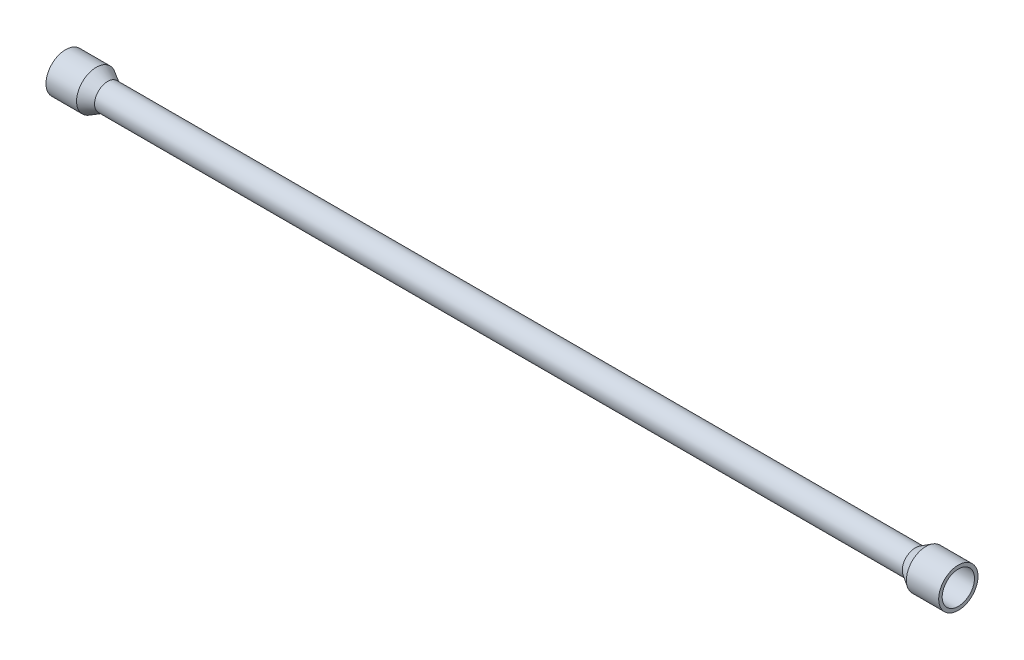
ISO-10303-21;
HEADER;
FILE_DESCRIPTION(('STEP AP214'),'2;1');
FILE_NAME('part.step','',(''),(''),'','','');
FILE_SCHEMA(('AUTOMOTIVE_DESIGN { 1 0 10303 214 1 1 1 1 }'));
ENDSEC;
DATA;
#1=APPLICATION_CONTEXT('core data for automotive mechanical design processes');
#2=APPLICATION_PROTOCOL_DEFINITION('international standard','automotive_design',2000,#1);
#3=PRODUCT_CONTEXT('',#1,'mechanical');
#4=PRODUCT('Part','Part','',(#3));
#5=PRODUCT_RELATED_PRODUCT_CATEGORY('part','',(#4));
#6=PRODUCT_DEFINITION_FORMATION('','',#4);
#7=PRODUCT_DEFINITION_CONTEXT('part definition',#1,'design');
#8=PRODUCT_DEFINITION('design','',#6,#7);
#9=PRODUCT_DEFINITION_SHAPE('','',#8);
#10=(LENGTH_UNIT() NAMED_UNIT(*) SI_UNIT(.MILLI.,.METRE.));
#11=(NAMED_UNIT(*) PLANE_ANGLE_UNIT() SI_UNIT($,.RADIAN.));
#12=(NAMED_UNIT(*) SI_UNIT($,.STERADIAN.) SOLID_ANGLE_UNIT());
#13=UNCERTAINTY_MEASURE_WITH_UNIT(LENGTH_MEASURE(1.E-05),#10,'distance_accuracy_value','');
#14=(GEOMETRIC_REPRESENTATION_CONTEXT(3) GLOBAL_UNCERTAINTY_ASSIGNED_CONTEXT((#13)) GLOBAL_UNIT_ASSIGNED_CONTEXT((#10,
#11,#12)) REPRESENTATION_CONTEXT('',''));
#15=CARTESIAN_POINT('',(0.,0.,0.));
#16=DIRECTION('',(0.,0.,1.));
#17=DIRECTION('',(1.,0.,0.));
#18=AXIS2_PLACEMENT_3D('',#15,#16,#17);
#19=CARTESIAN_POINT('',(0.,0.,0.));
#20=DIRECTION('',(1.,0.,0.));
#21=DIRECTION('',(0.,0.,-1.));
#22=AXIS2_PLACEMENT_3D('',#19,#20,#21);
#23=PLANE('',#22);
#24=CARTESIAN_POINT('',(0.,0.,0.));
#25=DIRECTION('',(1.,0.,0.));
#26=DIRECTION('',(0.,0.,-1.));
#27=AXIS2_PLACEMENT_3D('',#24,#25,#26);
#28=CIRCLE('',#27,37.5);
#29=CARTESIAN_POINT('',(0.,0.,-37.5));
#30=VERTEX_POINT('',#29);
#31=EDGE_CURVE('E53',#30,#30,#28,.T.);
#32=ORIENTED_EDGE('',*,*,#31,.T.);
#33=EDGE_LOOP('',(#32));
#34=FACE_BOUND('',#33,.T.);
#35=CARTESIAN_POINT('',(0.,0.,0.));
#36=DIRECTION('',(-1.,0.,0.));
#37=DIRECTION('',(0.,0.,1.));
#38=AXIS2_PLACEMENT_3D('',#35,#36,#37);
#39=CIRCLE('',#38,87.5);
#40=CARTESIAN_POINT('',(0.,0.,87.5));
#41=VERTEX_POINT('',#40);
#42=EDGE_CURVE('E89',#41,#41,#39,.T.);
#43=ORIENTED_EDGE('',*,*,#42,.T.);
#44=EDGE_LOOP('',(#43));
#45=FACE_BOUND('',#44,.T.);
#46=ADVANCED_FACE('F40',(#34,#45),#23,.F.);
#47=CARTESIAN_POINT('',(4750.,0.,0.));
#48=DIRECTION('',(1.,0.,0.));
#49=DIRECTION('',(0.,0.,-1.));
#50=AXIS2_PLACEMENT_3D('',#47,#48,#49);
#51=PLANE('',#50);
#52=CARTESIAN_POINT('',(4750.,0.,0.));
#53=DIRECTION('',(1.,0.,0.));
#54=DIRECTION('',(0.,0.,-1.));
#55=AXIS2_PLACEMENT_3D('',#52,#53,#54);
#56=CIRCLE('',#55,37.5);
#57=CARTESIAN_POINT('',(4750.,0.,-37.5));
#58=VERTEX_POINT('',#57);
#59=EDGE_CURVE('E48',#58,#58,#56,.T.);
#60=ORIENTED_EDGE('',*,*,#59,.F.);
#61=EDGE_LOOP('',(#60));
#62=FACE_BOUND('',#61,.T.);
#63=CARTESIAN_POINT('',(4750.,0.,0.));
#64=DIRECTION('',(1.,0.,0.));
#65=DIRECTION('',(0.,0.,-1.));
#66=AXIS2_PLACEMENT_3D('',#63,#64,#65);
#67=CIRCLE('',#66,92.5);
#68=CARTESIAN_POINT('',(4750.,0.,-92.5));
#69=VERTEX_POINT('',#68);
#70=EDGE_CURVE('E10',#69,#69,#67,.F.);
#71=ORIENTED_EDGE('',*,*,#70,.F.);
#72=EDGE_LOOP('',(#71));
#73=FACE_BOUND('',#72,.T.);
#74=ADVANCED_FACE('F117',(#62,#73),#51,.T.);
#75=CARTESIAN_POINT('',(4750.,0.,0.));
#76=DIRECTION('',(-1.,0.,0.));
#77=DIRECTION('',(0.,0.,1.));
#78=AXIS2_PLACEMENT_3D('',#75,#76,#77);
#79=CYLINDRICAL_SURFACE('',#78,75.);
#80=CARTESIAN_POINT('',(65.3632423715855,0.,0.));
#81=DIRECTION('',(1.,0.,0.));
#82=DIRECTION('',(0.,0.,-1.));
#83=AXIS2_PLACEMENT_3D('',#80,#81,#82);
#84=CIRCLE('',#83,75.);
#85=CARTESIAN_POINT('',(65.3632423715855,0.,-75.));
#86=VERTEX_POINT('',#85);
#87=EDGE_CURVE('E76',#86,#86,#84,.T.);
#88=ORIENTED_EDGE('',*,*,#87,.T.);
#89=EDGE_LOOP('',(#88));
#90=FACE_BOUND('',#89,.T.);
#91=CARTESIAN_POINT('',(4688.83491605422,0.,0.));
#92=DIRECTION('',(1.,0.,0.));
#93=DIRECTION('',(0.,0.,-1.));
#94=AXIS2_PLACEMENT_3D('',#91,#92,#93);
#95=CIRCLE('',#94,75.);
#96=CARTESIAN_POINT('',(4688.83491605422,0.,-75.));
#97=VERTEX_POINT('',#96);
#98=EDGE_CURVE('E59',#97,#97,#95,.T.);
#99=ORIENTED_EDGE('',*,*,#98,.F.);
#100=EDGE_LOOP('',(#99));
#101=FACE_BOUND('',#100,.T.);
#102=ADVANCED_FACE('F42',(#90,#101),#79,.T.);
#103=CARTESIAN_POINT('',(4750.,0.,0.));
#104=DIRECTION('',(-1.,0.,0.));
#105=DIRECTION('',(0.,0.,1.));
#106=AXIS2_PLACEMENT_3D('',#103,#104,#105);
#107=CYLINDRICAL_SURFACE('',#106,37.5);
#108=ORIENTED_EDGE('',*,*,#59,.T.);
#109=EDGE_LOOP('',(#108));
#110=FACE_BOUND('',#109,.T.);
#111=ORIENTED_EDGE('',*,*,#31,.F.);
#112=EDGE_LOOP('',(#111));
#113=FACE_BOUND('',#112,.T.);
#114=ADVANCED_FACE('F126',(#110,#113),#107,.F.);
#115=CARTESIAN_POINT('',(4750.,0.,0.));
#116=DIRECTION('',(1.,0.,0.));
#117=DIRECTION('',(0.,0.,-1.));
#118=AXIS2_PLACEMENT_3D('',#115,#116,#117);
#119=CONICAL_SURFACE('',#118,112.5,0.54999249210528);
#120=ORIENTED_EDGE('',*,*,#98,.T.);
#121=EDGE_LOOP('',(#120));
#122=FACE_BOUND('',#121,.T.);
#123=CARTESIAN_POINT('',(4750.,0.,0.));
#124=DIRECTION('',(1.,0.,0.));
#125=DIRECTION('',(0.,0.,-1.));
#126=AXIS2_PLACEMENT_3D('',#123,#124,#125);
#127=CIRCLE('',#126,112.5);
#128=CARTESIAN_POINT('',(4750.,0.,-112.5));
#129=VERTEX_POINT('',#128);
#130=EDGE_CURVE('E64',#129,#129,#127,.T.);
#131=ORIENTED_EDGE('',*,*,#130,.F.);
#132=EDGE_LOOP('',(#131));
#133=FACE_BOUND('',#132,.T.);
#134=ADVANCED_FACE('F129',(#122,#133),#119,.T.);
#135=CARTESIAN_POINT('',(4935.,0.,0.));
#136=DIRECTION('',(1.,0.,0.));
#137=DIRECTION('',(0.,0.,-1.));
#138=AXIS2_PLACEMENT_3D('',#135,#136,#137);
#139=PLANE('',#138);
#140=CARTESIAN_POINT('',(4935.,0.,0.));
#141=DIRECTION('',(1.,0.,0.));
#142=DIRECTION('',(0.,0.,-1.));
#143=AXIS2_PLACEMENT_3D('',#140,#141,#142);
#144=CIRCLE('',#143,112.5);
#145=CARTESIAN_POINT('',(4935.,0.,-112.5));
#146=VERTEX_POINT('',#145);
#147=EDGE_CURVE('E68',#146,#146,#144,.T.);
#148=ORIENTED_EDGE('',*,*,#147,.T.);
#149=EDGE_LOOP('',(#148));
#150=FACE_BOUND('',#149,.T.);
#151=CARTESIAN_POINT('',(4935.,0.,0.));
#152=DIRECTION('',(1.,0.,0.));
#153=DIRECTION('',(0.,0.,-1.));
#154=AXIS2_PLACEMENT_3D('',#151,#152,#153);
#155=CIRCLE('',#154,92.5);
#156=CARTESIAN_POINT('',(4935.,0.,-92.5));
#157=VERTEX_POINT('',#156);
#158=EDGE_CURVE('E72',#157,#157,#155,.T.);
#159=ORIENTED_EDGE('',*,*,#158,.F.);
#160=EDGE_LOOP('',(#159));
#161=FACE_BOUND('',#160,.T.);
#162=ADVANCED_FACE('F132',(#150,#161),#139,.T.);
#163=CARTESIAN_POINT('',(4935.,0.,0.));
#164=DIRECTION('',(-1.,0.,0.));
#165=DIRECTION('',(0.,0.,1.));
#166=AXIS2_PLACEMENT_3D('',#163,#164,#165);
#167=CYLINDRICAL_SURFACE('',#166,112.5);
#168=ORIENTED_EDGE('',*,*,#147,.F.);
#169=EDGE_LOOP('',(#168));
#170=FACE_BOUND('',#169,.T.);
#171=ORIENTED_EDGE('',*,*,#130,.T.);
#172=EDGE_LOOP('',(#171));
#173=FACE_BOUND('',#172,.T.);
#174=ADVANCED_FACE('F134',(#170,#173),#167,.T.);
#175=CARTESIAN_POINT('',(4935.,0.,0.));
#176=DIRECTION('',(-1.,0.,0.));
#177=DIRECTION('',(0.,0.,1.));
#178=AXIS2_PLACEMENT_3D('',#175,#176,#177);
#179=CYLINDRICAL_SURFACE('',#178,92.5);
#180=ORIENTED_EDGE('',*,*,#158,.T.);
#181=EDGE_LOOP('',(#180));
#182=FACE_BOUND('',#181,.T.);
#183=ORIENTED_EDGE('',*,*,#70,.T.);
#184=EDGE_LOOP('',(#183));
#185=FACE_BOUND('',#184,.T.);
#186=ADVANCED_FACE('F112',(#182,#185),#179,.F.);
#187=CARTESIAN_POINT('',(65.3632423715855,0.,0.));
#188=DIRECTION('',(-1.,0.,0.));
#189=DIRECTION('',(0.,0.,1.));
#190=AXIS2_PLACEMENT_3D('',#187,#188,#189);
#191=CONICAL_SURFACE('',#190,75.,0.520869498434888);
#192=CARTESIAN_POINT('',(0.,0.,0.));
#193=DIRECTION('',(-1.,0.,0.));
#194=DIRECTION('',(0.,0.,1.));
#195=AXIS2_PLACEMENT_3D('',#192,#193,#194);
#196=CIRCLE('',#195,112.5);
#197=CARTESIAN_POINT('',(0.,0.,112.5));
#198=VERTEX_POINT('',#197);
#199=EDGE_CURVE('E81',#198,#198,#196,.T.);
#200=ORIENTED_EDGE('',*,*,#199,.F.);
#201=EDGE_LOOP('',(#200));
#202=FACE_BOUND('',#201,.T.);
#203=ORIENTED_EDGE('',*,*,#87,.F.);
#204=EDGE_LOOP('',(#203));
#205=FACE_BOUND('',#204,.T.);
#206=ADVANCED_FACE('F103',(#202,#205),#191,.T.);
#207=CARTESIAN_POINT('',(-175.,0.,0.));
#208=DIRECTION('',(-1.,0.,0.));
#209=DIRECTION('',(0.,0.,1.));
#210=AXIS2_PLACEMENT_3D('',#207,#208,#209);
#211=PLANE('',#210);
#212=CARTESIAN_POINT('',(-175.,0.,0.));
#213=DIRECTION('',(-1.,0.,0.));
#214=DIRECTION('',(0.,0.,1.));
#215=AXIS2_PLACEMENT_3D('',#212,#213,#214);
#216=CIRCLE('',#215,112.5);
#217=CARTESIAN_POINT('',(-175.,0.,112.5));
#218=VERTEX_POINT('',#217);
#219=EDGE_CURVE('E80',#218,#218,#216,.T.);
#220=ORIENTED_EDGE('',*,*,#219,.T.);
#221=EDGE_LOOP('',(#220));
#222=FACE_BOUND('',#221,.T.);
#223=CARTESIAN_POINT('',(-175.,0.,0.));
#224=DIRECTION('',(-1.,0.,0.));
#225=DIRECTION('',(0.,0.,1.));
#226=AXIS2_PLACEMENT_3D('',#223,#224,#225);
#227=CIRCLE('',#226,87.5);
#228=CARTESIAN_POINT('',(-175.,0.,87.5));
#229=VERTEX_POINT('',#228);
#230=EDGE_CURVE('E85',#229,#229,#227,.T.);
#231=ORIENTED_EDGE('',*,*,#230,.F.);
#232=EDGE_LOOP('',(#231));
#233=FACE_BOUND('',#232,.T.);
#234=ADVANCED_FACE('F100',(#222,#233),#211,.T.);
#235=CARTESIAN_POINT('',(-175.,0.,0.));
#236=DIRECTION('',(1.,0.,0.));
#237=DIRECTION('',(0.,0.,-1.));
#238=AXIS2_PLACEMENT_3D('',#235,#236,#237);
#239=CYLINDRICAL_SURFACE('',#238,112.5);
#240=ORIENTED_EDGE('',*,*,#219,.F.);
#241=EDGE_LOOP('',(#240));
#242=FACE_BOUND('',#241,.T.);
#243=ORIENTED_EDGE('',*,*,#199,.T.);
#244=EDGE_LOOP('',(#243));
#245=FACE_BOUND('',#244,.T.);
#246=ADVANCED_FACE('F102',(#242,#245),#239,.T.);
#247=CARTESIAN_POINT('',(-175.,0.,0.));
#248=DIRECTION('',(1.,0.,0.));
#249=DIRECTION('',(0.,0.,-1.));
#250=AXIS2_PLACEMENT_3D('',#247,#248,#249);
#251=CYLINDRICAL_SURFACE('',#250,87.5);
#252=ORIENTED_EDGE('',*,*,#230,.T.);
#253=EDGE_LOOP('',(#252));
#254=FACE_BOUND('',#253,.T.);
#255=ORIENTED_EDGE('',*,*,#42,.F.);
#256=EDGE_LOOP('',(#255));
#257=FACE_BOUND('',#256,.T.);
#258=ADVANCED_FACE('F97',(#254,#257),#251,.F.);
#259=CLOSED_SHELL('',(#46,#74,#102,#114,#134,#162,#174,#186,#206,#234,#246,#258));
#260=MANIFOLD_SOLID_BREP('B2',#259);
#261=ADVANCED_BREP_SHAPE_REPRESENTATION('',(#18,#260),#14);
#262=SHAPE_DEFINITION_REPRESENTATION(#9,#261);
ENDSEC;
END-ISO-10303-21;
